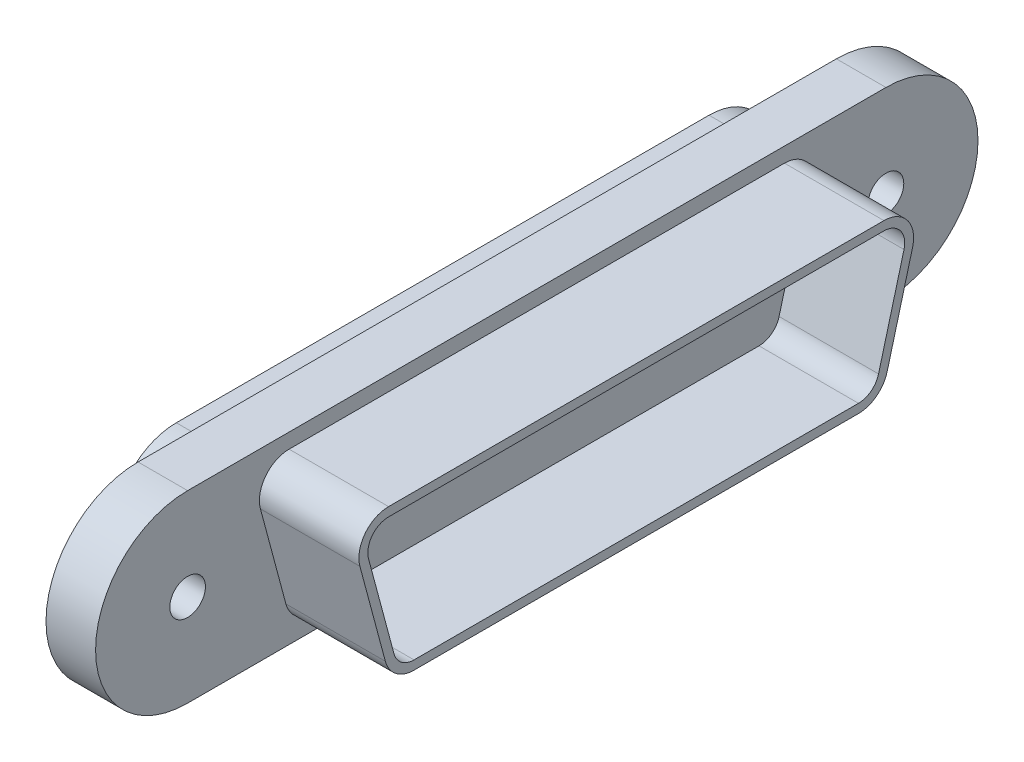
ISO-10303-21;
HEADER;
FILE_DESCRIPTION(('STEP AP214'),'2;1');
FILE_NAME('part.step','',(''),(''),'','','');
FILE_SCHEMA(('AUTOMOTIVE_DESIGN { 1 0 10303 214 1 1 1 1 }'));
ENDSEC;
DATA;
#1=APPLICATION_CONTEXT('core data for automotive mechanical design processes');
#2=APPLICATION_PROTOCOL_DEFINITION('international standard','automotive_design',2000,#1);
#3=PRODUCT_CONTEXT('',#1,'mechanical');
#4=PRODUCT('Part','Part','',(#3));
#5=PRODUCT_RELATED_PRODUCT_CATEGORY('part','',(#4));
#6=PRODUCT_DEFINITION_FORMATION('','',#4);
#7=PRODUCT_DEFINITION_CONTEXT('part definition',#1,'design');
#8=PRODUCT_DEFINITION('design','',#6,#7);
#9=PRODUCT_DEFINITION_SHAPE('','',#8);
#10=(LENGTH_UNIT() NAMED_UNIT(*) SI_UNIT(.MILLI.,.METRE.));
#11=(NAMED_UNIT(*) PLANE_ANGLE_UNIT() SI_UNIT($,.RADIAN.));
#12=(NAMED_UNIT(*) SI_UNIT($,.STERADIAN.) SOLID_ANGLE_UNIT());
#13=UNCERTAINTY_MEASURE_WITH_UNIT(LENGTH_MEASURE(1.E-05),#10,'distance_accuracy_value','');
#14=(GEOMETRIC_REPRESENTATION_CONTEXT(3) GLOBAL_UNCERTAINTY_ASSIGNED_CONTEXT((#13)) GLOBAL_UNIT_ASSIGNED_CONTEXT((#10,
#11,#12)) REPRESENTATION_CONTEXT('',''));
#15=CARTESIAN_POINT('',(0.,0.,0.));
#16=DIRECTION('',(0.,0.,1.));
#17=DIRECTION('',(1.,0.,0.));
#18=AXIS2_PLACEMENT_3D('',#15,#16,#17);
#19=CARTESIAN_POINT('',(0.,0.,29.8704));
#20=DIRECTION('',(1.,0.,0.));
#21=DIRECTION('',(0.,0.,-1.));
#22=AXIS2_PLACEMENT_3D('',#19,#20,#21);
#23=PLANE('',#22);
#24=CARTESIAN_POINT('',(0.,0.,29.8704));
#25=DIRECTION('',(1.,0.,0.));
#26=DIRECTION('',(0.,0.,-1.));
#27=AXIS2_PLACEMENT_3D('',#24,#25,#26);
#28=CIRCLE('',#27,7.874);
#29=CARTESIAN_POINT('',(0.,7.874,29.8704));
#30=VERTEX_POINT('',#29);
#31=CARTESIAN_POINT('',(0.,-7.874,29.8704));
#32=VERTEX_POINT('',#31);
#33=EDGE_CURVE('E355',#30,#32,#28,.T.);
#34=ORIENTED_EDGE('',*,*,#33,.F.);
#35=DIRECTION('',(0.,0.,1.));
#36=VECTOR('',#35,1.);
#37=CARTESIAN_POINT('',(0.,7.874,29.8704));
#38=LINE('',#37,#36);
#39=CARTESIAN_POINT('',(0.,7.87400000000001,-29.8704));
#40=VERTEX_POINT('',#39);
#41=EDGE_CURVE('E360',#40,#30,#38,.T.);
#42=ORIENTED_EDGE('',*,*,#41,.F.);
#43=CARTESIAN_POINT('',(0.,0.,-29.8704));
#44=DIRECTION('',(1.,0.,0.));
#45=DIRECTION('',(0.,0.,-1.));
#46=AXIS2_PLACEMENT_3D('',#43,#44,#45);
#47=CIRCLE('',#46,7.874);
#48=CARTESIAN_POINT('',(0.,-7.87399999999999,-29.8704));
#49=VERTEX_POINT('',#48);
#50=EDGE_CURVE('E371',#49,#40,#47,.T.);
#51=ORIENTED_EDGE('',*,*,#50,.F.);
#52=DIRECTION('',(0.,0.,-1.));
#53=VECTOR('',#52,1.);
#54=CARTESIAN_POINT('',(0.,-7.874,29.8704));
#55=LINE('',#54,#53);
#56=EDGE_CURVE('E369',#32,#49,#55,.T.);
#57=ORIENTED_EDGE('',*,*,#56,.F.);
#58=EDGE_LOOP('',(#34,#42,#51,#57));
#59=FACE_BOUND('',#58,.T.);
#60=CARTESIAN_POINT('',(0.,0.,-29.8704));
#61=DIRECTION('',(1.,0.,0.));
#62=DIRECTION('',(0.,0.,-1.));
#63=AXIS2_PLACEMENT_3D('',#60,#61,#62);
#64=CIRCLE('',#63,1.524);
#65=CARTESIAN_POINT('',(0.,0.,-31.3944));
#66=VERTEX_POINT('',#65);
#67=EDGE_CURVE('E231',#66,#66,#64,.T.);
#68=ORIENTED_EDGE('',*,*,#67,.T.);
#69=EDGE_LOOP('',(#68));
#70=FACE_BOUND('',#69,.T.);
#71=CARTESIAN_POINT('',(0.,0.,29.8704));
#72=DIRECTION('',(1.,0.,0.));
#73=DIRECTION('',(0.,0.,-1.));
#74=AXIS2_PLACEMENT_3D('',#71,#72,#73);
#75=CIRCLE('',#74,1.524);
#76=CARTESIAN_POINT('',(0.,0.,28.3464));
#77=VERTEX_POINT('',#76);
#78=EDGE_CURVE('E220',#77,#77,#75,.T.);
#79=ORIENTED_EDGE('',*,*,#78,.T.);
#80=EDGE_LOOP('',(#79));
#81=FACE_BOUND('',#80,.T.);
#82=CARTESIAN_POINT('',(0.,0.,-22.7862958130066));
#83=DIRECTION('',(-1.,0.,0.));
#84=DIRECTION('',(0.,0.,1.));
#85=AXIS2_PLACEMENT_3D('',#82,#83,#84);
#86=CIRCLE('',#85,5.33400000000001);
#87=CARTESIAN_POINT('',(0.,5.33400000000001,-22.7862958130066));
#88=VERTEX_POINT('',#87);
#89=CARTESIAN_POINT('',(0.,-5.33400000000001,-22.7862958130066));
#90=VERTEX_POINT('',#89);
#91=EDGE_CURVE('E216',#88,#90,#86,.T.);
#92=ORIENTED_EDGE('',*,*,#91,.F.);
#93=DIRECTION('',(0.,0.,-1.));
#94=VECTOR('',#93,1.);
#95=CARTESIAN_POINT('',(0.,5.33400000000001,-22.7862958130066));
#96=LINE('',#95,#94);
#97=CARTESIAN_POINT('',(0.,5.33400000000002,22.7862958130066));
#98=VERTEX_POINT('',#97);
#99=EDGE_CURVE('E213',#98,#88,#96,.T.);
#100=ORIENTED_EDGE('',*,*,#99,.F.);
#101=CARTESIAN_POINT('',(0.,0.,22.7862958130066));
#102=DIRECTION('',(-1.,0.,0.));
#103=DIRECTION('',(0.,0.,1.));
#104=AXIS2_PLACEMENT_3D('',#101,#102,#103);
#105=CIRCLE('',#104,5.33400000000001);
#106=CARTESIAN_POINT('',(0.,-5.33400000000001,22.7862958130066));
#107=VERTEX_POINT('',#106);
#108=EDGE_CURVE('E55',#107,#98,#105,.T.);
#109=ORIENTED_EDGE('',*,*,#108,.F.);
#110=DIRECTION('',(0.,0.,1.));
#111=VECTOR('',#110,1.);
#112=CARTESIAN_POINT('',(0.,-5.33400000000001,-22.7862958130066));
#113=LINE('',#112,#111);
#114=EDGE_CURVE('E50',#90,#107,#113,.T.);
#115=ORIENTED_EDGE('',*,*,#114,.F.);
#116=EDGE_LOOP('',(#92,#100,#109,#115));
#117=FACE_BOUND('',#116,.T.);
#118=ADVANCED_FACE('F35',(#59,#70,#81,#117),#23,.F.);
#119=CARTESIAN_POINT('',(4.2418,0.,29.8704));
#120=DIRECTION('',(1.,0.,0.));
#121=DIRECTION('',(0.,0.,-1.));
#122=AXIS2_PLACEMENT_3D('',#119,#120,#121);
#123=PLANE('',#122);
#124=CARTESIAN_POINT('',(4.2418,0.,29.8704));
#125=DIRECTION('',(1.,0.,0.));
#126=DIRECTION('',(0.,0.,-1.));
#127=AXIS2_PLACEMENT_3D('',#124,#125,#126);
#128=CIRCLE('',#127,1.52399999999999);
#129=CARTESIAN_POINT('',(4.2418,0.,28.3464));
#130=VERTEX_POINT('',#129);
#131=EDGE_CURVE('E217',#130,#130,#128,.T.);
#132=ORIENTED_EDGE('',*,*,#131,.F.);
#133=EDGE_LOOP('',(#132));
#134=FACE_BOUND('',#133,.T.);
#135=CARTESIAN_POINT('',(4.2418,0.,-29.8704));
#136=DIRECTION('',(1.,0.,0.));
#137=DIRECTION('',(0.,0.,-1.));
#138=AXIS2_PLACEMENT_3D('',#135,#136,#137);
#139=CIRCLE('',#138,1.52399999999999);
#140=CARTESIAN_POINT('',(4.2418,0.,-31.3944));
#141=VERTEX_POINT('',#140);
#142=EDGE_CURVE('E228',#141,#141,#139,.T.);
#143=ORIENTED_EDGE('',*,*,#142,.F.);
#144=EDGE_LOOP('',(#143));
#145=FACE_BOUND('',#144,.T.);
#146=CARTESIAN_POINT('',(4.2418,0.,29.8704));
#147=DIRECTION('',(1.,0.,0.));
#148=DIRECTION('',(0.,0.,-1.));
#149=AXIS2_PLACEMENT_3D('',#146,#147,#148);
#150=CIRCLE('',#149,7.874);
#151=CARTESIAN_POINT('',(4.2418,7.874,29.8704));
#152=VERTEX_POINT('',#151);
#153=CARTESIAN_POINT('',(4.2418,-7.874,29.8704));
#154=VERTEX_POINT('',#153);
#155=EDGE_CURVE('E356',#152,#154,#150,.T.);
#156=ORIENTED_EDGE('',*,*,#155,.T.);
#157=DIRECTION('',(0.,0.,-1.));
#158=VECTOR('',#157,1.);
#159=CARTESIAN_POINT('',(4.2418,-7.874,29.8704));
#160=LINE('',#159,#158);
#161=CARTESIAN_POINT('',(4.2418,-7.87399999999999,-29.8704));
#162=VERTEX_POINT('',#161);
#163=EDGE_CURVE('E359',#154,#162,#160,.T.);
#164=ORIENTED_EDGE('',*,*,#163,.T.);
#165=CARTESIAN_POINT('',(4.2418,0.,-29.8704));
#166=DIRECTION('',(1.,0.,0.));
#167=DIRECTION('',(0.,0.,-1.));
#168=AXIS2_PLACEMENT_3D('',#165,#166,#167);
#169=CIRCLE('',#168,7.874);
#170=CARTESIAN_POINT('',(4.2418,7.87400000000001,-29.8704));
#171=VERTEX_POINT('',#170);
#172=EDGE_CURVE('E362',#162,#171,#169,.T.);
#173=ORIENTED_EDGE('',*,*,#172,.T.);
#174=DIRECTION('',(0.,0.,1.));
#175=VECTOR('',#174,1.);
#176=CARTESIAN_POINT('',(4.2418,7.874,29.8704));
#177=LINE('',#176,#175);
#178=EDGE_CURVE('E364',#171,#152,#177,.T.);
#179=ORIENTED_EDGE('',*,*,#178,.T.);
#180=EDGE_LOOP('',(#156,#164,#173,#179));
#181=FACE_BOUND('',#180,.T.);
#182=DIRECTION('',(0.,-0.96592582628907,-0.258819045102515));
#183=VECTOR('',#182,1.);
#184=CARTESIAN_POINT('',(4.2418,-4.72140037456037,21.4636681156775));
#185=LINE('',#184,#183);
#186=CARTESIAN_POINT('',(4.2418,3.40659962543959,23.6415591517576));
#187=VERTEX_POINT('',#186);
#188=CARTESIAN_POINT('',(4.2418,-4.72140037456037,21.4636681156775));
#189=VERTEX_POINT('',#188);
#190=EDGE_CURVE('E320',#187,#189,#185,.T.);
#191=ORIENTED_EDGE('',*,*,#190,.F.);
#192=CARTESIAN_POINT('',(4.2418,4.064,21.1881075529834));
#193=DIRECTION('',(1.,0.,0.));
#194=DIRECTION('',(0.,0.,1.));
#195=AXIS2_PLACEMENT_3D('',#192,#193,#194);
#196=CIRCLE('',#195,2.54);
#197=CARTESIAN_POINT('',(4.2418,6.604,21.1881075529833));
#198=VERTEX_POINT('',#197);
#199=EDGE_CURVE('E284',#198,#187,#196,.T.);
#200=ORIENTED_EDGE('',*,*,#199,.F.);
#201=DIRECTION('',(0.,0.,1.));
#202=VECTOR('',#201,1.);
#203=CARTESIAN_POINT('',(4.2418,6.604,21.1881075529833));
#204=LINE('',#203,#202);
#205=CARTESIAN_POINT('',(4.2418,6.604,-21.1881075529833));
#206=VERTEX_POINT('',#205);
#207=EDGE_CURVE('E303',#206,#198,#204,.T.);
#208=ORIENTED_EDGE('',*,*,#207,.F.);
#209=CARTESIAN_POINT('',(4.2418,4.064,-21.1881075529834));
#210=DIRECTION('',(1.,0.,0.));
#211=DIRECTION('',(0.,0.,1.));
#212=AXIS2_PLACEMENT_3D('',#209,#210,#211);
#213=CIRCLE('',#212,2.54);
#214=CARTESIAN_POINT('',(4.2418,3.40659962543959,-23.6415591517576));
#215=VERTEX_POINT('',#214);
#216=EDGE_CURVE('E330',#215,#206,#213,.T.);
#217=ORIENTED_EDGE('',*,*,#216,.F.);
#218=DIRECTION('',(0.,0.96592582628907,-0.258819045102514));
#219=VECTOR('',#218,1.);
#220=CARTESIAN_POINT('',(4.2418,-4.72140037456037,-21.4636681156775));
#221=LINE('',#220,#219);
#222=CARTESIAN_POINT('',(4.2418,-4.72140037456037,-21.4636681156775));
#223=VERTEX_POINT('',#222);
#224=EDGE_CURVE('E328',#223,#215,#221,.T.);
#225=ORIENTED_EDGE('',*,*,#224,.F.);
#226=CARTESIAN_POINT('',(4.2418,-4.064,-19.0102165169033));
#227=DIRECTION('',(1.,0.,0.));
#228=DIRECTION('',(0.,0.,1.));
#229=AXIS2_PLACEMENT_3D('',#226,#227,#228);
#230=CIRCLE('',#229,2.54);
#231=CARTESIAN_POINT('',(4.2418,-6.604,-19.0102165169032));
#232=VERTEX_POINT('',#231);
#233=EDGE_CURVE('E326',#232,#223,#230,.T.);
#234=ORIENTED_EDGE('',*,*,#233,.F.);
#235=DIRECTION('',(0.,0.,-1.));
#236=VECTOR('',#235,1.);
#237=CARTESIAN_POINT('',(4.2418,-6.604,19.0102165169032));
#238=LINE('',#237,#236);
#239=CARTESIAN_POINT('',(4.2418,-6.604,19.0102165169032));
#240=VERTEX_POINT('',#239);
#241=EDGE_CURVE('E324',#240,#232,#238,.T.);
#242=ORIENTED_EDGE('',*,*,#241,.F.);
#243=CARTESIAN_POINT('',(4.2418,-4.064,19.0102165169032));
#244=DIRECTION('',(1.,0.,0.));
#245=DIRECTION('',(0.,0.,-1.));
#246=AXIS2_PLACEMENT_3D('',#243,#244,#245);
#247=CIRCLE('',#246,2.54);
#248=EDGE_CURVE('E322',#189,#240,#247,.T.);
#249=ORIENTED_EDGE('',*,*,#248,.F.);
#250=EDGE_LOOP('',(#191,#200,#208,#217,#225,#234,#242,#249));
#251=FACE_BOUND('',#250,.T.);
#252=ADVANCED_FACE('F398',(#134,#145,#181,#251),#123,.T.);
#253=CARTESIAN_POINT('',(4.2418,0.,29.8704));
#254=DIRECTION('',(-1.,0.,0.));
#255=DIRECTION('',(0.,0.,1.));
#256=AXIS2_PLACEMENT_3D('',#253,#254,#255);
#257=CYLINDRICAL_SURFACE('',#256,7.874);
#258=ORIENTED_EDGE('',*,*,#33,.T.);
#259=DIRECTION('',(-1.,0.,0.));
#260=VECTOR('',#259,1.);
#261=CARTESIAN_POINT('',(4.2418,-7.874,29.8704));
#262=LINE('',#261,#260);
#263=EDGE_CURVE('E11',#154,#32,#262,.T.);
#264=ORIENTED_EDGE('',*,*,#263,.F.);
#265=ORIENTED_EDGE('',*,*,#155,.F.);
#266=DIRECTION('',(-1.,0.,0.));
#267=VECTOR('',#266,1.);
#268=CARTESIAN_POINT('',(4.2418,7.874,29.8704));
#269=LINE('',#268,#267);
#270=EDGE_CURVE('E366',#152,#30,#269,.T.);
#271=ORIENTED_EDGE('',*,*,#270,.T.);
#272=EDGE_LOOP('',(#258,#264,#265,#271));
#273=FACE_BOUND('',#272,.T.);
#274=ADVANCED_FACE('F37',(#273),#257,.T.);
#275=CARTESIAN_POINT('',(4.2418,-7.874,29.8704));
#276=DIRECTION('',(0.,1.,0.));
#277=DIRECTION('',(0.,0.,1.));
#278=AXIS2_PLACEMENT_3D('',#275,#276,#277);
#279=PLANE('',#278);
#280=ORIENTED_EDGE('',*,*,#56,.T.);
#281=DIRECTION('',(-1.,0.,0.));
#282=VECTOR('',#281,1.);
#283=CARTESIAN_POINT('',(4.2418,-7.87399999999999,-29.8704));
#284=LINE('',#283,#282);
#285=EDGE_CURVE('E43',#162,#49,#284,.T.);
#286=ORIENTED_EDGE('',*,*,#285,.F.);
#287=ORIENTED_EDGE('',*,*,#163,.F.);
#288=ORIENTED_EDGE('',*,*,#263,.T.);
#289=EDGE_LOOP('',(#280,#286,#287,#288));
#290=FACE_BOUND('',#289,.T.);
#291=ADVANCED_FACE('F400',(#290),#279,.F.);
#292=CARTESIAN_POINT('',(4.2418,0.,-29.8704));
#293=DIRECTION('',(-1.,0.,0.));
#294=DIRECTION('',(0.,0.,1.));
#295=AXIS2_PLACEMENT_3D('',#292,#293,#294);
#296=CYLINDRICAL_SURFACE('',#295,7.874);
#297=ORIENTED_EDGE('',*,*,#50,.T.);
#298=DIRECTION('',(-1.,0.,0.));
#299=VECTOR('',#298,1.);
#300=CARTESIAN_POINT('',(4.2418,7.87400000000001,-29.8704));
#301=LINE('',#300,#299);
#302=EDGE_CURVE('E376',#171,#40,#301,.T.);
#303=ORIENTED_EDGE('',*,*,#302,.F.);
#304=ORIENTED_EDGE('',*,*,#172,.F.);
#305=ORIENTED_EDGE('',*,*,#285,.T.);
#306=EDGE_LOOP('',(#297,#303,#304,#305));
#307=FACE_BOUND('',#306,.T.);
#308=ADVANCED_FACE('F383',(#307),#296,.T.);
#309=CARTESIAN_POINT('',(4.2418,7.874,29.8704));
#310=DIRECTION('',(0.,-1.,0.));
#311=DIRECTION('',(0.,0.,-1.));
#312=AXIS2_PLACEMENT_3D('',#309,#310,#311);
#313=PLANE('',#312);
#314=ORIENTED_EDGE('',*,*,#41,.T.);
#315=ORIENTED_EDGE('',*,*,#270,.F.);
#316=ORIENTED_EDGE('',*,*,#178,.F.);
#317=ORIENTED_EDGE('',*,*,#302,.T.);
#318=EDGE_LOOP('',(#314,#315,#316,#317));
#319=FACE_BOUND('',#318,.T.);
#320=ADVANCED_FACE('F392',(#319),#313,.F.);
#321=CARTESIAN_POINT('',(12.7508,4.064,21.1881075529834));
#322=DIRECTION('',(-1.,0.,0.));
#323=DIRECTION('',(0.,0.,1.));
#324=AXIS2_PLACEMENT_3D('',#321,#322,#323);
#325=CYLINDRICAL_SURFACE('',#324,2.54);
#326=ORIENTED_EDGE('',*,*,#199,.T.);
#327=DIRECTION('',(-1.,0.,0.));
#328=VECTOR('',#327,1.);
#329=CARTESIAN_POINT('',(12.7508,3.40659962543959,23.6415591517576));
#330=LINE('',#329,#328);
#331=CARTESIAN_POINT('',(12.7508,3.40659962543959,23.6415591517576));
#332=VERTEX_POINT('',#331);
#333=EDGE_CURVE('E353',#332,#187,#330,.T.);
#334=ORIENTED_EDGE('',*,*,#333,.F.);
#335=CARTESIAN_POINT('',(12.7508,4.064,21.1881075529834));
#336=DIRECTION('',(1.,0.,0.));
#337=DIRECTION('',(0.,0.,1.));
#338=AXIS2_PLACEMENT_3D('',#335,#336,#337);
#339=CIRCLE('',#338,2.54);
#340=CARTESIAN_POINT('',(12.7508,6.604,21.1881075529833));
#341=VERTEX_POINT('',#340);
#342=EDGE_CURVE('E299',#341,#332,#339,.T.);
#343=ORIENTED_EDGE('',*,*,#342,.F.);
#344=DIRECTION('',(-1.,0.,0.));
#345=VECTOR('',#344,1.);
#346=CARTESIAN_POINT('',(12.7508,6.604,21.1881075529833));
#347=LINE('',#346,#345);
#348=EDGE_CURVE('E317',#341,#198,#347,.T.);
#349=ORIENTED_EDGE('',*,*,#348,.T.);
#350=EDGE_LOOP('',(#326,#334,#343,#349));
#351=FACE_BOUND('',#350,.T.);
#352=ADVANCED_FACE('F417',(#351),#325,.T.);
#353=CARTESIAN_POINT('',(12.7508,-4.72140037456037,21.4636681156775));
#354=DIRECTION('',(0.,0.258819045102515,-0.96592582628907));
#355=DIRECTION('',(0.,0.96592582628907,0.258819045102515));
#356=AXIS2_PLACEMENT_3D('',#353,#354,#355);
#357=PLANE('',#356);
#358=ORIENTED_EDGE('',*,*,#190,.T.);
#359=DIRECTION('',(-1.,0.,0.));
#360=VECTOR('',#359,1.);
#361=CARTESIAN_POINT('',(12.7508,-4.72140037456037,21.4636681156775));
#362=LINE('',#361,#360);
#363=CARTESIAN_POINT('',(12.7508,-4.72140037456037,21.4636681156775));
#364=VERTEX_POINT('',#363);
#365=EDGE_CURVE('E350',#364,#189,#362,.T.);
#366=ORIENTED_EDGE('',*,*,#365,.F.);
#367=DIRECTION('',(0.,-0.96592582628907,-0.258819045102515));
#368=VECTOR('',#367,1.);
#369=CARTESIAN_POINT('',(12.7508,-4.72140037456037,21.4636681156775));
#370=LINE('',#369,#368);
#371=EDGE_CURVE('E302',#332,#364,#370,.T.);
#372=ORIENTED_EDGE('',*,*,#371,.F.);
#373=ORIENTED_EDGE('',*,*,#333,.T.);
#374=EDGE_LOOP('',(#358,#366,#372,#373));
#375=FACE_BOUND('',#374,.T.);
#376=ADVANCED_FACE('F421',(#375),#357,.F.);
#377=CARTESIAN_POINT('',(12.7508,-4.064,19.0102165169032));
#378=DIRECTION('',(-1.,0.,0.));
#379=DIRECTION('',(0.,0.,1.));
#380=AXIS2_PLACEMENT_3D('',#377,#378,#379);
#381=CYLINDRICAL_SURFACE('',#380,2.54);
#382=ORIENTED_EDGE('',*,*,#248,.T.);
#383=DIRECTION('',(-1.,0.,0.));
#384=VECTOR('',#383,1.);
#385=CARTESIAN_POINT('',(12.7508,-6.604,19.0102165169032));
#386=LINE('',#385,#384);
#387=CARTESIAN_POINT('',(12.7508,-6.604,19.0102165169032));
#388=VERTEX_POINT('',#387);
#389=EDGE_CURVE('E347',#388,#240,#386,.T.);
#390=ORIENTED_EDGE('',*,*,#389,.F.);
#391=CARTESIAN_POINT('',(12.7508,-4.064,19.0102165169032));
#392=DIRECTION('',(1.,0.,0.));
#393=DIRECTION('',(0.,0.,-1.));
#394=AXIS2_PLACEMENT_3D('',#391,#392,#393);
#395=CIRCLE('',#394,2.54);
#396=EDGE_CURVE('E305',#364,#388,#395,.T.);
#397=ORIENTED_EDGE('',*,*,#396,.F.);
#398=ORIENTED_EDGE('',*,*,#365,.T.);
#399=EDGE_LOOP('',(#382,#390,#397,#398));
#400=FACE_BOUND('',#399,.T.);
#401=ADVANCED_FACE('F426',(#400),#381,.T.);
#402=CARTESIAN_POINT('',(12.7508,-6.604,19.0102165169032));
#403=DIRECTION('',(0.,1.,0.));
#404=DIRECTION('',(0.,0.,1.));
#405=AXIS2_PLACEMENT_3D('',#402,#403,#404);
#406=PLANE('',#405);
#407=ORIENTED_EDGE('',*,*,#241,.T.);
#408=DIRECTION('',(-1.,0.,0.));
#409=VECTOR('',#408,1.);
#410=CARTESIAN_POINT('',(12.7508,-6.604,-19.0102165169032));
#411=LINE('',#410,#409);
#412=CARTESIAN_POINT('',(12.7508,-6.604,-19.0102165169032));
#413=VERTEX_POINT('',#412);
#414=EDGE_CURVE('E344',#413,#232,#411,.T.);
#415=ORIENTED_EDGE('',*,*,#414,.F.);
#416=DIRECTION('',(0.,0.,-1.));
#417=VECTOR('',#416,1.);
#418=CARTESIAN_POINT('',(12.7508,-6.604,19.0102165169032));
#419=LINE('',#418,#417);
#420=EDGE_CURVE('E307',#388,#413,#419,.T.);
#421=ORIENTED_EDGE('',*,*,#420,.F.);
#422=ORIENTED_EDGE('',*,*,#389,.T.);
#423=EDGE_LOOP('',(#407,#415,#421,#422));
#424=FACE_BOUND('',#423,.T.);
#425=ADVANCED_FACE('F432',(#424),#406,.F.);
#426=CARTESIAN_POINT('',(12.7508,-4.064,-19.0102165169033));
#427=DIRECTION('',(-1.,0.,0.));
#428=DIRECTION('',(0.,0.,1.));
#429=AXIS2_PLACEMENT_3D('',#426,#427,#428);
#430=CYLINDRICAL_SURFACE('',#429,2.54);
#431=ORIENTED_EDGE('',*,*,#233,.T.);
#432=DIRECTION('',(-1.,0.,0.));
#433=VECTOR('',#432,1.);
#434=CARTESIAN_POINT('',(12.7508,-4.72140037456037,-21.4636681156775));
#435=LINE('',#434,#433);
#436=CARTESIAN_POINT('',(12.7508,-4.72140037456037,-21.4636681156775));
#437=VERTEX_POINT('',#436);
#438=EDGE_CURVE('E341',#437,#223,#435,.T.);
#439=ORIENTED_EDGE('',*,*,#438,.F.);
#440=CARTESIAN_POINT('',(12.7508,-4.064,-19.0102165169033));
#441=DIRECTION('',(1.,0.,0.));
#442=DIRECTION('',(0.,0.,1.));
#443=AXIS2_PLACEMENT_3D('',#440,#441,#442);
#444=CIRCLE('',#443,2.54);
#445=EDGE_CURVE('E309',#413,#437,#444,.T.);
#446=ORIENTED_EDGE('',*,*,#445,.F.);
#447=ORIENTED_EDGE('',*,*,#414,.T.);
#448=EDGE_LOOP('',(#431,#439,#446,#447));
#449=FACE_BOUND('',#448,.T.);
#450=ADVANCED_FACE('F436',(#449),#430,.T.);
#451=CARTESIAN_POINT('',(12.7508,-4.72140037456037,-21.4636681156775));
#452=DIRECTION('',(0.,0.258819045102514,0.96592582628907));
#453=DIRECTION('',(0.,-0.96592582628907,0.258819045102514));
#454=AXIS2_PLACEMENT_3D('',#451,#452,#453);
#455=PLANE('',#454);
#456=ORIENTED_EDGE('',*,*,#224,.T.);
#457=DIRECTION('',(-1.,0.,0.));
#458=VECTOR('',#457,1.);
#459=CARTESIAN_POINT('',(12.7508,3.40659962543959,-23.6415591517576));
#460=LINE('',#459,#458);
#461=CARTESIAN_POINT('',(12.7508,3.40659962543959,-23.6415591517576));
#462=VERTEX_POINT('',#461);
#463=EDGE_CURVE('E338',#462,#215,#460,.T.);
#464=ORIENTED_EDGE('',*,*,#463,.F.);
#465=DIRECTION('',(0.,0.96592582628907,-0.258819045102514));
#466=VECTOR('',#465,1.);
#467=CARTESIAN_POINT('',(12.7508,-4.72140037456037,-21.4636681156775));
#468=LINE('',#467,#466);
#469=EDGE_CURVE('E311',#437,#462,#468,.T.);
#470=ORIENTED_EDGE('',*,*,#469,.F.);
#471=ORIENTED_EDGE('',*,*,#438,.T.);
#472=EDGE_LOOP('',(#456,#464,#470,#471));
#473=FACE_BOUND('',#472,.T.);
#474=ADVANCED_FACE('F440',(#473),#455,.F.);
#475=CARTESIAN_POINT('',(12.7508,4.064,-21.1881075529834));
#476=DIRECTION('',(-1.,0.,0.));
#477=DIRECTION('',(0.,0.,1.));
#478=AXIS2_PLACEMENT_3D('',#475,#476,#477);
#479=CYLINDRICAL_SURFACE('',#478,2.54);
#480=ORIENTED_EDGE('',*,*,#216,.T.);
#481=DIRECTION('',(-1.,0.,0.));
#482=VECTOR('',#481,1.);
#483=CARTESIAN_POINT('',(12.7508,6.604,-21.1881075529833));
#484=LINE('',#483,#482);
#485=CARTESIAN_POINT('',(12.7508,6.604,-21.1881075529833));
#486=VERTEX_POINT('',#485);
#487=EDGE_CURVE('E336',#486,#206,#484,.T.);
#488=ORIENTED_EDGE('',*,*,#487,.F.);
#489=CARTESIAN_POINT('',(12.7508,4.064,-21.1881075529834));
#490=DIRECTION('',(1.,0.,0.));
#491=DIRECTION('',(0.,0.,1.));
#492=AXIS2_PLACEMENT_3D('',#489,#490,#491);
#493=CIRCLE('',#492,2.54);
#494=EDGE_CURVE('E313',#462,#486,#493,.T.);
#495=ORIENTED_EDGE('',*,*,#494,.F.);
#496=ORIENTED_EDGE('',*,*,#463,.T.);
#497=EDGE_LOOP('',(#480,#488,#495,#496));
#498=FACE_BOUND('',#497,.T.);
#499=ADVANCED_FACE('F444',(#498),#479,.T.);
#500=CARTESIAN_POINT('',(12.7508,6.604,21.1881075529833));
#501=DIRECTION('',(0.,-1.,0.));
#502=DIRECTION('',(0.,0.,-1.));
#503=AXIS2_PLACEMENT_3D('',#500,#501,#502);
#504=PLANE('',#503);
#505=ORIENTED_EDGE('',*,*,#207,.T.);
#506=ORIENTED_EDGE('',*,*,#348,.F.);
#507=DIRECTION('',(0.,0.,1.));
#508=VECTOR('',#507,1.);
#509=CARTESIAN_POINT('',(12.7508,6.604,21.1881075529833));
#510=LINE('',#509,#508);
#511=EDGE_CURVE('E315',#486,#341,#510,.T.);
#512=ORIENTED_EDGE('',*,*,#511,.F.);
#513=ORIENTED_EDGE('',*,*,#487,.T.);
#514=EDGE_LOOP('',(#505,#506,#512,#513));
#515=FACE_BOUND('',#514,.T.);
#516=ADVANCED_FACE('F448',(#515),#504,.F.);
#517=CARTESIAN_POINT('',(12.7508,4.064,21.1881075529834));
#518=DIRECTION('',(-1.,0.,0.));
#519=DIRECTION('',(0.,0.,1.));
#520=AXIS2_PLACEMENT_3D('',#517,#518,#519);
#521=PLANE('',#520);
#522=DIRECTION('',(0.,-0.96592582628907,-0.258819045102515));
#523=VECTOR('',#522,1.);
#524=CARTESIAN_POINT('',(12.7508,3.60381973780771,22.9055236721253));
#525=LINE('',#524,#523);
#526=CARTESIAN_POINT('',(12.7508,3.60381973780771,22.9055236721253));
#527=VERTEX_POINT('',#526);
#528=CARTESIAN_POINT('',(12.7508,-4.52418026219225,20.7276326360452));
#529=VERTEX_POINT('',#528);
#530=EDGE_CURVE('E262',#527,#529,#525,.T.);
#531=ORIENTED_EDGE('',*,*,#530,.F.);
#532=CARTESIAN_POINT('',(12.7508,4.064,21.1881075529834));
#533=DIRECTION('',(1.,0.,0.));
#534=DIRECTION('',(0.,0.,-1.));
#535=AXIS2_PLACEMENT_3D('',#532,#533,#534);
#536=CIRCLE('',#535,1.778);
#537=CARTESIAN_POINT('',(12.7508,5.842,21.1881075529833));
#538=VERTEX_POINT('',#537);
#539=EDGE_CURVE('E234',#538,#527,#536,.T.);
#540=ORIENTED_EDGE('',*,*,#539,.F.);
#541=DIRECTION('',(0.,0.,1.));
#542=VECTOR('',#541,1.);
#543=CARTESIAN_POINT('',(12.7508,5.842,-21.1881075529833));
#544=LINE('',#543,#542);
#545=CARTESIAN_POINT('',(12.7508,5.842,-21.1881075529833));
#546=VERTEX_POINT('',#545);
#547=EDGE_CURVE('E239',#546,#538,#544,.T.);
#548=ORIENTED_EDGE('',*,*,#547,.F.);
#549=CARTESIAN_POINT('',(12.7508,4.064,-21.1881075529834));
#550=DIRECTION('',(1.,0.,0.));
#551=DIRECTION('',(0.,0.,-1.));
#552=AXIS2_PLACEMENT_3D('',#549,#550,#551);
#553=CIRCLE('',#552,1.778);
#554=CARTESIAN_POINT('',(12.7508,3.60381973780771,-22.9055236721253));
#555=VERTEX_POINT('',#554);
#556=EDGE_CURVE('E277',#555,#546,#553,.T.);
#557=ORIENTED_EDGE('',*,*,#556,.F.);
#558=DIRECTION('',(0.,0.96592582628907,-0.258819045102514));
#559=VECTOR('',#558,1.);
#560=CARTESIAN_POINT('',(12.7508,-4.52418026219226,-20.7276326360452));
#561=LINE('',#560,#559);
#562=CARTESIAN_POINT('',(12.7508,-4.52418026219226,-20.7276326360452));
#563=VERTEX_POINT('',#562);
#564=EDGE_CURVE('E274',#563,#555,#561,.T.);
#565=ORIENTED_EDGE('',*,*,#564,.F.);
#566=CARTESIAN_POINT('',(12.7508,-4.064,-19.0102165169033));
#567=DIRECTION('',(1.,0.,0.));
#568=DIRECTION('',(0.,0.,-1.));
#569=AXIS2_PLACEMENT_3D('',#566,#567,#568);
#570=CIRCLE('',#569,1.778);
#571=CARTESIAN_POINT('',(12.7508,-5.842,-19.0102165169032));
#572=VERTEX_POINT('',#571);
#573=EDGE_CURVE('E271',#572,#563,#570,.T.);
#574=ORIENTED_EDGE('',*,*,#573,.F.);
#575=DIRECTION('',(0.,0.,-1.));
#576=VECTOR('',#575,1.);
#577=CARTESIAN_POINT('',(12.7508,-5.842,19.0102165169032));
#578=LINE('',#577,#576);
#579=CARTESIAN_POINT('',(12.7508,-5.842,19.0102165169032));
#580=VERTEX_POINT('',#579);
#581=EDGE_CURVE('E268',#580,#572,#578,.T.);
#582=ORIENTED_EDGE('',*,*,#581,.F.);
#583=CARTESIAN_POINT('',(12.7508,-4.064,19.0102165169032));
#584=DIRECTION('',(1.,0.,0.));
#585=DIRECTION('',(0.,0.,-1.));
#586=AXIS2_PLACEMENT_3D('',#583,#584,#585);
#587=CIRCLE('',#586,1.778);
#588=EDGE_CURVE('E265',#529,#580,#587,.T.);
#589=ORIENTED_EDGE('',*,*,#588,.F.);
#590=EDGE_LOOP('',(#531,#540,#548,#557,#565,#574,#582,#589));
#591=FACE_BOUND('',#590,.T.);
#592=ORIENTED_EDGE('',*,*,#342,.T.);
#593=ORIENTED_EDGE('',*,*,#371,.T.);
#594=ORIENTED_EDGE('',*,*,#396,.T.);
#595=ORIENTED_EDGE('',*,*,#420,.T.);
#596=ORIENTED_EDGE('',*,*,#445,.T.);
#597=ORIENTED_EDGE('',*,*,#469,.T.);
#598=ORIENTED_EDGE('',*,*,#494,.T.);
#599=ORIENTED_EDGE('',*,*,#511,.T.);
#600=EDGE_LOOP('',(#592,#593,#594,#595,#596,#597,#598,#599));
#601=FACE_BOUND('',#600,.T.);
#602=ADVANCED_FACE('F452',(#591,#601),#521,.F.);
#603=CARTESIAN_POINT('',(4.2418,4.064,21.1881075529834));
#604=DIRECTION('',(1.,0.,0.));
#605=DIRECTION('',(0.,0.,-1.));
#606=AXIS2_PLACEMENT_3D('',#603,#604,#605);
#607=CYLINDRICAL_SURFACE('',#606,1.778);
#608=ORIENTED_EDGE('',*,*,#539,.T.);
#609=DIRECTION('',(1.,0.,0.));
#610=VECTOR('',#609,1.);
#611=CARTESIAN_POINT('',(4.2418,3.60381973780771,22.9055236721253));
#612=LINE('',#611,#610);
#613=CARTESIAN_POINT('',(4.2418,3.60381973780771,22.9055236721253));
#614=VERTEX_POINT('',#613);
#615=EDGE_CURVE('E260',#614,#527,#612,.T.);
#616=ORIENTED_EDGE('',*,*,#615,.F.);
#617=CARTESIAN_POINT('',(4.2418,4.064,21.1881075529834));
#618=DIRECTION('',(1.,0.,0.));
#619=DIRECTION('',(0.,0.,-1.));
#620=AXIS2_PLACEMENT_3D('',#617,#618,#619);
#621=CIRCLE('',#620,1.778);
#622=CARTESIAN_POINT('',(4.2418,5.842,21.1881075529833));
#623=VERTEX_POINT('',#622);
#624=EDGE_CURVE('E235',#623,#614,#621,.T.);
#625=ORIENTED_EDGE('',*,*,#624,.F.);
#626=DIRECTION('',(1.,0.,0.));
#627=VECTOR('',#626,1.);
#628=CARTESIAN_POINT('',(4.2418,5.842,21.1881075529833));
#629=LINE('',#628,#627);
#630=EDGE_CURVE('E282',#623,#538,#629,.T.);
#631=ORIENTED_EDGE('',*,*,#630,.T.);
#632=EDGE_LOOP('',(#608,#616,#625,#631));
#633=FACE_BOUND('',#632,.T.);
#634=ADVANCED_FACE('F456',(#633),#607,.F.);
#635=CARTESIAN_POINT('',(4.2418,5.842,-21.1881075529833));
#636=DIRECTION('',(0.,1.,0.));
#637=DIRECTION('',(0.,0.,1.));
#638=AXIS2_PLACEMENT_3D('',#635,#636,#637);
#639=PLANE('',#638);
#640=ORIENTED_EDGE('',*,*,#547,.T.);
#641=ORIENTED_EDGE('',*,*,#630,.F.);
#642=DIRECTION('',(0.,0.,1.));
#643=VECTOR('',#642,1.);
#644=CARTESIAN_POINT('',(4.2418,5.842,-21.1881075529833));
#645=LINE('',#644,#643);
#646=CARTESIAN_POINT('',(4.2418,5.842,-21.1881075529833));
#647=VERTEX_POINT('',#646);
#648=EDGE_CURVE('E257',#647,#623,#645,.T.);
#649=ORIENTED_EDGE('',*,*,#648,.F.);
#650=DIRECTION('',(1.,0.,0.));
#651=VECTOR('',#650,1.);
#652=CARTESIAN_POINT('',(4.2418,5.842,-21.1881075529833));
#653=LINE('',#652,#651);
#654=EDGE_CURVE('E285',#647,#546,#653,.T.);
#655=ORIENTED_EDGE('',*,*,#654,.T.);
#656=EDGE_LOOP('',(#640,#641,#649,#655));
#657=FACE_BOUND('',#656,.T.);
#658=ADVANCED_FACE('F460',(#657),#639,.F.);
#659=CARTESIAN_POINT('',(4.2418,4.064,-21.1881075529834));
#660=DIRECTION('',(1.,0.,0.));
#661=DIRECTION('',(0.,0.,-1.));
#662=AXIS2_PLACEMENT_3D('',#659,#660,#661);
#663=CYLINDRICAL_SURFACE('',#662,1.778);
#664=ORIENTED_EDGE('',*,*,#556,.T.);
#665=ORIENTED_EDGE('',*,*,#654,.F.);
#666=CARTESIAN_POINT('',(4.2418,4.064,-21.1881075529834));
#667=DIRECTION('',(1.,0.,0.));
#668=DIRECTION('',(0.,0.,-1.));
#669=AXIS2_PLACEMENT_3D('',#666,#667,#668);
#670=CIRCLE('',#669,1.778);
#671=CARTESIAN_POINT('',(4.2418,3.60381973780771,-22.9055236721253));
#672=VERTEX_POINT('',#671);
#673=EDGE_CURVE('E254',#672,#647,#670,.T.);
#674=ORIENTED_EDGE('',*,*,#673,.F.);
#675=DIRECTION('',(1.,0.,0.));
#676=VECTOR('',#675,1.);
#677=CARTESIAN_POINT('',(4.2418,3.60381973780771,-22.9055236721253));
#678=LINE('',#677,#676);
#679=EDGE_CURVE('E287',#672,#555,#678,.T.);
#680=ORIENTED_EDGE('',*,*,#679,.T.);
#681=EDGE_LOOP('',(#664,#665,#674,#680));
#682=FACE_BOUND('',#681,.T.);
#683=ADVANCED_FACE('F482',(#682),#663,.F.);
#684=CARTESIAN_POINT('',(4.2418,-4.52418026219226,-20.7276326360452));
#685=DIRECTION('',(0.,-0.258819045102514,-0.96592582628907));
#686=DIRECTION('',(0.,0.96592582628907,-0.258819045102514));
#687=AXIS2_PLACEMENT_3D('',#684,#685,#686);
#688=PLANE('',#687);
#689=ORIENTED_EDGE('',*,*,#564,.T.);
#690=ORIENTED_EDGE('',*,*,#679,.F.);
#691=DIRECTION('',(0.,0.96592582628907,-0.258819045102514));
#692=VECTOR('',#691,1.);
#693=CARTESIAN_POINT('',(4.2418,-4.52418026219226,-20.7276326360452));
#694=LINE('',#693,#692);
#695=CARTESIAN_POINT('',(4.2418,-4.52418026219226,-20.7276326360452));
#696=VERTEX_POINT('',#695);
#697=EDGE_CURVE('E251',#696,#672,#694,.T.);
#698=ORIENTED_EDGE('',*,*,#697,.F.);
#699=DIRECTION('',(1.,0.,0.));
#700=VECTOR('',#699,1.);
#701=CARTESIAN_POINT('',(4.2418,-4.52418026219226,-20.7276326360452));
#702=LINE('',#701,#700);
#703=EDGE_CURVE('E289',#696,#563,#702,.T.);
#704=ORIENTED_EDGE('',*,*,#703,.T.);
#705=EDGE_LOOP('',(#689,#690,#698,#704));
#706=FACE_BOUND('',#705,.T.);
#707=ADVANCED_FACE('F478',(#706),#688,.F.);
#708=CARTESIAN_POINT('',(4.2418,-4.064,-19.0102165169033));
#709=DIRECTION('',(1.,0.,0.));
#710=DIRECTION('',(0.,0.,-1.));
#711=AXIS2_PLACEMENT_3D('',#708,#709,#710);
#712=CYLINDRICAL_SURFACE('',#711,1.778);
#713=ORIENTED_EDGE('',*,*,#573,.T.);
#714=ORIENTED_EDGE('',*,*,#703,.F.);
#715=CARTESIAN_POINT('',(4.2418,-4.064,-19.0102165169033));
#716=DIRECTION('',(1.,0.,0.));
#717=DIRECTION('',(0.,0.,-1.));
#718=AXIS2_PLACEMENT_3D('',#715,#716,#717);
#719=CIRCLE('',#718,1.778);
#720=CARTESIAN_POINT('',(4.2418,-5.842,-19.0102165169032));
#721=VERTEX_POINT('',#720);
#722=EDGE_CURVE('E248',#721,#696,#719,.T.);
#723=ORIENTED_EDGE('',*,*,#722,.F.);
#724=DIRECTION('',(1.,0.,0.));
#725=VECTOR('',#724,1.);
#726=CARTESIAN_POINT('',(4.2418,-5.842,-19.0102165169032));
#727=LINE('',#726,#725);
#728=EDGE_CURVE('E291',#721,#572,#727,.T.);
#729=ORIENTED_EDGE('',*,*,#728,.T.);
#730=EDGE_LOOP('',(#713,#714,#723,#729));
#731=FACE_BOUND('',#730,.T.);
#732=ADVANCED_FACE('F474',(#731),#712,.F.);
#733=CARTESIAN_POINT('',(4.2418,-5.842,19.0102165169032));
#734=DIRECTION('',(0.,-1.,0.));
#735=DIRECTION('',(0.,0.,-1.));
#736=AXIS2_PLACEMENT_3D('',#733,#734,#735);
#737=PLANE('',#736);
#738=ORIENTED_EDGE('',*,*,#581,.T.);
#739=ORIENTED_EDGE('',*,*,#728,.F.);
#740=DIRECTION('',(0.,0.,-1.));
#741=VECTOR('',#740,1.);
#742=CARTESIAN_POINT('',(4.2418,-5.842,19.0102165169032));
#743=LINE('',#742,#741);
#744=CARTESIAN_POINT('',(4.2418,-5.842,19.0102165169032));
#745=VERTEX_POINT('',#744);
#746=EDGE_CURVE('E245',#745,#721,#743,.T.);
#747=ORIENTED_EDGE('',*,*,#746,.F.);
#748=DIRECTION('',(1.,0.,0.));
#749=VECTOR('',#748,1.);
#750=CARTESIAN_POINT('',(4.2418,-5.842,19.0102165169032));
#751=LINE('',#750,#749);
#752=EDGE_CURVE('E293',#745,#580,#751,.T.);
#753=ORIENTED_EDGE('',*,*,#752,.T.);
#754=EDGE_LOOP('',(#738,#739,#747,#753));
#755=FACE_BOUND('',#754,.T.);
#756=ADVANCED_FACE('F470',(#755),#737,.F.);
#757=CARTESIAN_POINT('',(4.2418,-4.064,19.0102165169032));
#758=DIRECTION('',(1.,0.,0.));
#759=DIRECTION('',(0.,0.,-1.));
#760=AXIS2_PLACEMENT_3D('',#757,#758,#759);
#761=CYLINDRICAL_SURFACE('',#760,1.778);
#762=ORIENTED_EDGE('',*,*,#588,.T.);
#763=ORIENTED_EDGE('',*,*,#752,.F.);
#764=CARTESIAN_POINT('',(4.2418,-4.064,19.0102165169032));
#765=DIRECTION('',(1.,0.,0.));
#766=DIRECTION('',(0.,0.,-1.));
#767=AXIS2_PLACEMENT_3D('',#764,#765,#766);
#768=CIRCLE('',#767,1.778);
#769=CARTESIAN_POINT('',(4.2418,-4.52418026219225,20.7276326360452));
#770=VERTEX_POINT('',#769);
#771=EDGE_CURVE('E242',#770,#745,#768,.T.);
#772=ORIENTED_EDGE('',*,*,#771,.F.);
#773=DIRECTION('',(1.,0.,0.));
#774=VECTOR('',#773,1.);
#775=CARTESIAN_POINT('',(4.2418,-4.52418026219225,20.7276326360452));
#776=LINE('',#775,#774);
#777=EDGE_CURVE('E295',#770,#529,#776,.T.);
#778=ORIENTED_EDGE('',*,*,#777,.T.);
#779=EDGE_LOOP('',(#762,#763,#772,#778));
#780=FACE_BOUND('',#779,.T.);
#781=ADVANCED_FACE('F466',(#780),#761,.F.);
#782=CARTESIAN_POINT('',(4.2418,3.60381973780771,22.9055236721253));
#783=DIRECTION('',(0.,-0.258819045102515,0.96592582628907));
#784=DIRECTION('',(0.,-0.96592582628907,-0.258819045102515));
#785=AXIS2_PLACEMENT_3D('',#782,#783,#784);
#786=PLANE('',#785);
#787=ORIENTED_EDGE('',*,*,#530,.T.);
#788=ORIENTED_EDGE('',*,*,#777,.F.);
#789=DIRECTION('',(0.,-0.96592582628907,-0.258819045102515));
#790=VECTOR('',#789,1.);
#791=CARTESIAN_POINT('',(4.2418,3.60381973780771,22.9055236721253));
#792=LINE('',#791,#790);
#793=EDGE_CURVE('E238',#614,#770,#792,.T.);
#794=ORIENTED_EDGE('',*,*,#793,.F.);
#795=ORIENTED_EDGE('',*,*,#615,.T.);
#796=EDGE_LOOP('',(#787,#788,#794,#795));
#797=FACE_BOUND('',#796,.T.);
#798=ADVANCED_FACE('F462',(#797),#786,.F.);
#799=CARTESIAN_POINT('',(4.2418,4.064,21.1881075529834));
#800=DIRECTION('',(1.,0.,0.));
#801=DIRECTION('',(0.,0.,-1.));
#802=AXIS2_PLACEMENT_3D('',#799,#800,#801);
#803=PLANE('',#802);
#804=ORIENTED_EDGE('',*,*,#624,.T.);
#805=ORIENTED_EDGE('',*,*,#793,.T.);
#806=ORIENTED_EDGE('',*,*,#771,.T.);
#807=ORIENTED_EDGE('',*,*,#746,.T.);
#808=ORIENTED_EDGE('',*,*,#722,.T.);
#809=ORIENTED_EDGE('',*,*,#697,.T.);
#810=ORIENTED_EDGE('',*,*,#673,.T.);
#811=ORIENTED_EDGE('',*,*,#648,.T.);
#812=EDGE_LOOP('',(#804,#805,#806,#807,#808,#809,#810,#811));
#813=FACE_BOUND('',#812,.T.);
#814=ADVANCED_FACE('F465',(#813),#803,.T.);
#815=CARTESIAN_POINT('',(4.2418,0.,-29.8704));
#816=DIRECTION('',(1.,0.,0.));
#817=DIRECTION('',(0.,0.,-1.));
#818=AXIS2_PLACEMENT_3D('',#815,#816,#817);
#819=CYLINDRICAL_SURFACE('',#818,1.52399999999999);
#820=ORIENTED_EDGE('',*,*,#67,.F.);
#821=EDGE_LOOP('',(#820));
#822=FACE_BOUND('',#821,.T.);
#823=ORIENTED_EDGE('',*,*,#142,.T.);
#824=EDGE_LOOP('',(#823));
#825=FACE_BOUND('',#824,.T.);
#826=ADVANCED_FACE('F492',(#822,#825),#819,.F.);
#827=CARTESIAN_POINT('',(4.2418,0.,29.8704));
#828=DIRECTION('',(1.,0.,0.));
#829=DIRECTION('',(0.,0.,-1.));
#830=AXIS2_PLACEMENT_3D('',#827,#828,#829);
#831=CYLINDRICAL_SURFACE('',#830,1.52399999999999);
#832=ORIENTED_EDGE('',*,*,#78,.F.);
#833=EDGE_LOOP('',(#832));
#834=FACE_BOUND('',#833,.T.);
#835=ORIENTED_EDGE('',*,*,#131,.T.);
#836=EDGE_LOOP('',(#835));
#837=FACE_BOUND('',#836,.T.);
#838=ADVANCED_FACE('F496',(#834,#837),#831,.F.);
#839=CARTESIAN_POINT('',(-3.81,0.,-22.7862958130066));
#840=DIRECTION('',(1.,0.,0.));
#841=DIRECTION('',(0.,0.,-1.));
#842=AXIS2_PLACEMENT_3D('',#839,#840,#841);
#843=CYLINDRICAL_SURFACE('',#842,5.33400000000001);
#844=ORIENTED_EDGE('',*,*,#91,.T.);
#845=DIRECTION('',(1.,0.,0.));
#846=VECTOR('',#845,1.);
#847=CARTESIAN_POINT('',(-3.81,-5.33400000000001,-22.7862958130066));
#848=LINE('',#847,#846);
#849=CARTESIAN_POINT('',(-3.81,-5.33400000000001,-22.7862958130066));
#850=VERTEX_POINT('',#849);
#851=EDGE_CURVE('E197',#850,#90,#848,.T.);
#852=ORIENTED_EDGE('',*,*,#851,.F.);
#853=CARTESIAN_POINT('',(-3.81,0.,-22.7862958130066));
#854=DIRECTION('',(-1.,0.,0.));
#855=DIRECTION('',(0.,0.,1.));
#856=AXIS2_PLACEMENT_3D('',#853,#854,#855);
#857=CIRCLE('',#856,5.33400000000001);
#858=CARTESIAN_POINT('',(-3.81,5.33400000000001,-22.7862958130066));
#859=VERTEX_POINT('',#858);
#860=EDGE_CURVE('E204',#859,#850,#857,.T.);
#861=ORIENTED_EDGE('',*,*,#860,.F.);
#862=DIRECTION('',(1.,0.,0.));
#863=VECTOR('',#862,1.);
#864=CARTESIAN_POINT('',(-3.81,5.33400000000001,-22.7862958130066));
#865=LINE('',#864,#863);
#866=EDGE_CURVE('E698',#859,#88,#865,.T.);
#867=ORIENTED_EDGE('',*,*,#866,.T.);
#868=EDGE_LOOP('',(#844,#852,#861,#867));
#869=FACE_BOUND('',#868,.T.);
#870=ADVANCED_FACE('F215',(#869),#843,.T.);
#871=CARTESIAN_POINT('',(-3.81,-5.33400000000001,-22.7862958130066));
#872=DIRECTION('',(0.,1.,0.));
#873=DIRECTION('',(0.,0.,1.));
#874=AXIS2_PLACEMENT_3D('',#871,#872,#873);
#875=PLANE('',#874);
#876=ORIENTED_EDGE('',*,*,#114,.T.);
#877=DIRECTION('',(1.,0.,0.));
#878=VECTOR('',#877,1.);
#879=CARTESIAN_POINT('',(-3.81,-5.33400000000001,22.7862958130066));
#880=LINE('',#879,#878);
#881=CARTESIAN_POINT('',(-3.81,-5.33400000000001,22.7862958130066));
#882=VERTEX_POINT('',#881);
#883=EDGE_CURVE('E200',#882,#107,#880,.T.);
#884=ORIENTED_EDGE('',*,*,#883,.F.);
#885=DIRECTION('',(0.,0.,1.));
#886=VECTOR('',#885,1.);
#887=CARTESIAN_POINT('',(-3.81,-5.33400000000001,-22.7862958130066));
#888=LINE('',#887,#886);
#889=EDGE_CURVE('E193',#850,#882,#888,.T.);
#890=ORIENTED_EDGE('',*,*,#889,.F.);
#891=ORIENTED_EDGE('',*,*,#851,.T.);
#892=EDGE_LOOP('',(#876,#884,#890,#891));
#893=FACE_BOUND('',#892,.T.);
#894=ADVANCED_FACE('F195',(#893),#875,.F.);
#895=CARTESIAN_POINT('',(-3.81,0.,22.7862958130066));
#896=DIRECTION('',(1.,0.,0.));
#897=DIRECTION('',(0.,0.,-1.));
#898=AXIS2_PLACEMENT_3D('',#895,#896,#897);
#899=CYLINDRICAL_SURFACE('',#898,5.33400000000001);
#900=ORIENTED_EDGE('',*,*,#108,.T.);
#901=DIRECTION('',(1.,0.,0.));
#902=VECTOR('',#901,1.);
#903=CARTESIAN_POINT('',(-3.81,5.33400000000002,22.7862958130066));
#904=LINE('',#903,#902);
#905=CARTESIAN_POINT('',(-3.81,5.33400000000002,22.7862958130066));
#906=VERTEX_POINT('',#905);
#907=EDGE_CURVE('E222',#906,#98,#904,.T.);
#908=ORIENTED_EDGE('',*,*,#907,.F.);
#909=CARTESIAN_POINT('',(-3.81,0.,22.7862958130066));
#910=DIRECTION('',(-1.,0.,0.));
#911=DIRECTION('',(0.,0.,1.));
#912=AXIS2_PLACEMENT_3D('',#909,#910,#911);
#913=CIRCLE('',#912,5.33400000000001);
#914=EDGE_CURVE('E203',#882,#906,#913,.T.);
#915=ORIENTED_EDGE('',*,*,#914,.F.);
#916=ORIENTED_EDGE('',*,*,#883,.T.);
#917=EDGE_LOOP('',(#900,#908,#915,#916));
#918=FACE_BOUND('',#917,.T.);
#919=ADVANCED_FACE('F505',(#918),#899,.T.);
#920=CARTESIAN_POINT('',(-3.81,5.33400000000001,-22.7862958130066));
#921=DIRECTION('',(0.,-1.,0.));
#922=DIRECTION('',(0.,0.,-1.));
#923=AXIS2_PLACEMENT_3D('',#920,#921,#922);
#924=PLANE('',#923);
#925=ORIENTED_EDGE('',*,*,#99,.T.);
#926=ORIENTED_EDGE('',*,*,#866,.F.);
#927=DIRECTION('',(0.,0.,-1.));
#928=VECTOR('',#927,1.);
#929=CARTESIAN_POINT('',(-3.81,5.33400000000001,-22.7862958130066));
#930=LINE('',#929,#928);
#931=EDGE_CURVE('E209',#906,#859,#930,.T.);
#932=ORIENTED_EDGE('',*,*,#931,.F.);
#933=ORIENTED_EDGE('',*,*,#907,.T.);
#934=EDGE_LOOP('',(#925,#926,#932,#933));
#935=FACE_BOUND('',#934,.T.);
#936=ADVANCED_FACE('F508',(#935),#924,.F.);
#937=CARTESIAN_POINT('',(-3.81,0.,-22.7862958130066));
#938=DIRECTION('',(-1.,0.,0.));
#939=DIRECTION('',(0.,0.,1.));
#940=AXIS2_PLACEMENT_3D('',#937,#938,#939);
#941=PLANE('',#940);
#942=ORIENTED_EDGE('',*,*,#860,.T.);
#943=ORIENTED_EDGE('',*,*,#889,.T.);
#944=ORIENTED_EDGE('',*,*,#914,.T.);
#945=ORIENTED_EDGE('',*,*,#931,.T.);
#946=EDGE_LOOP('',(#942,#943,#944,#945));
#947=FACE_BOUND('',#946,.T.);
#948=ADVANCED_FACE('F207',(#947),#941,.T.);
#949=CLOSED_SHELL('',(#118,#252,#274,#291,#308,#320,#352,#376,#401,#425,#450,#474,#499,#516,
#602,#634,#658,#683,#707,#732,#756,#781,#798,#814,#826,#838,#870,#894,#919,#936,#948));
#950=MANIFOLD_SOLID_BREP('B2',#949);
#951=ADVANCED_BREP_SHAPE_REPRESENTATION('',(#18,#950),#14);
#952=SHAPE_DEFINITION_REPRESENTATION(#9,#951);
ENDSEC;
END-ISO-10303-21;
